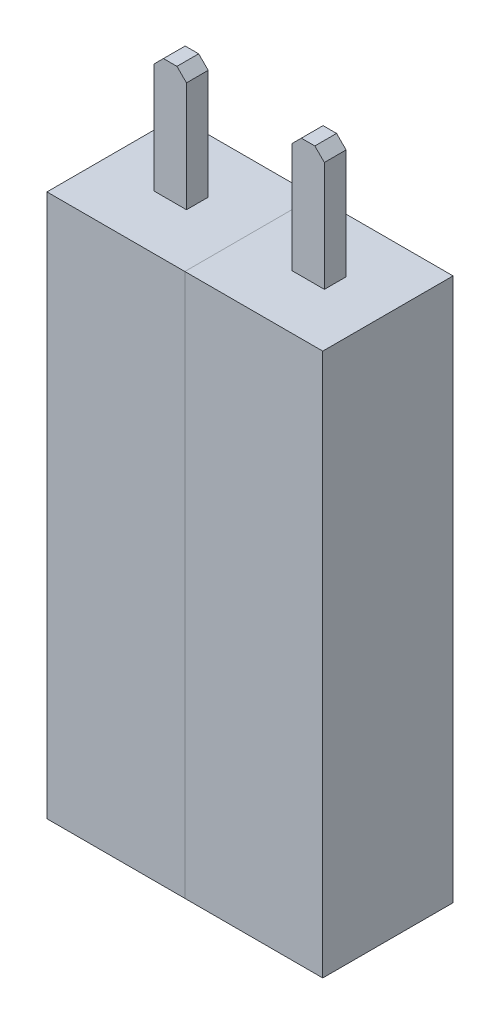
ISO-10303-21;
HEADER;
FILE_DESCRIPTION(('STEP AP214'),'2;1');
FILE_NAME('part.step','',(''),(''),'','','');
FILE_SCHEMA(('AUTOMOTIVE_DESIGN { 1 0 10303 214 1 1 1 1 }'));
ENDSEC;
DATA;
#1=APPLICATION_CONTEXT('core data for automotive mechanical design processes');
#2=APPLICATION_PROTOCOL_DEFINITION('international standard','automotive_design',2000,#1);
#3=PRODUCT_CONTEXT('',#1,'mechanical');
#4=PRODUCT('Part','Part','',(#3));
#5=PRODUCT_RELATED_PRODUCT_CATEGORY('part','',(#4));
#6=PRODUCT_DEFINITION_FORMATION('','',#4);
#7=PRODUCT_DEFINITION_CONTEXT('part definition',#1,'design');
#8=PRODUCT_DEFINITION('design','',#6,#7);
#9=PRODUCT_DEFINITION_SHAPE('','',#8);
#10=(LENGTH_UNIT() NAMED_UNIT(*) SI_UNIT(.MILLI.,.METRE.));
#11=(NAMED_UNIT(*) PLANE_ANGLE_UNIT() SI_UNIT($,.RADIAN.));
#12=(NAMED_UNIT(*) SI_UNIT($,.STERADIAN.) SOLID_ANGLE_UNIT());
#13=UNCERTAINTY_MEASURE_WITH_UNIT(LENGTH_MEASURE(1.E-05),#10,'distance_accuracy_value','');
#14=(GEOMETRIC_REPRESENTATION_CONTEXT(3) GLOBAL_UNCERTAINTY_ASSIGNED_CONTEXT((#13)) GLOBAL_UNIT_ASSIGNED_CONTEXT((#10,
#11,#12)) REPRESENTATION_CONTEXT('',''));
#15=CARTESIAN_POINT('',(0.,0.,0.));
#16=DIRECTION('',(0.,0.,1.));
#17=DIRECTION('',(1.,0.,0.));
#18=AXIS2_PLACEMENT_3D('',#15,#16,#17);
#19=CARTESIAN_POINT('',(3.81,5.,1.2));
#20=DIRECTION('',(-1.,0.,0.));
#21=DIRECTION('',(0.,-1.,0.));
#22=AXIS2_PLACEMENT_3D('',#19,#20,#21);
#23=PLANE('',#22);
#24=DIRECTION('',(0.,1.,0.));
#25=VECTOR('',#24,1.);
#26=CARTESIAN_POINT('',(3.81,5.,-1.2));
#27=LINE('',#26,#25);
#28=CARTESIAN_POINT('',(3.81,-5.,-1.2));
#29=VERTEX_POINT('',#28);
#30=CARTESIAN_POINT('',(3.81,5.,-1.2));
#31=VERTEX_POINT('',#30);
#32=EDGE_CURVE('E198',#29,#31,#27,.T.);
#33=ORIENTED_EDGE('',*,*,#32,.T.);
#34=DIRECTION('',(0.,0.,-1.));
#35=VECTOR('',#34,1.);
#36=CARTESIAN_POINT('',(3.81,5.,1.2));
#37=LINE('',#36,#35);
#38=CARTESIAN_POINT('',(3.81,5.,1.2));
#39=VERTEX_POINT('',#38);
#40=EDGE_CURVE('E12',#39,#31,#37,.T.);
#41=ORIENTED_EDGE('',*,*,#40,.F.);
#42=DIRECTION('',(0.,1.,0.));
#43=VECTOR('',#42,1.);
#44=CARTESIAN_POINT('',(3.81,5.,1.2));
#45=LINE('',#44,#43);
#46=CARTESIAN_POINT('',(3.81,-5.,1.2));
#47=VERTEX_POINT('',#46);
#48=EDGE_CURVE('E204',#47,#39,#45,.T.);
#49=ORIENTED_EDGE('',*,*,#48,.F.);
#50=DIRECTION('',(0.,0.,-1.));
#51=VECTOR('',#50,1.);
#52=CARTESIAN_POINT('',(3.81,-5.,1.2));
#53=LINE('',#52,#51);
#54=EDGE_CURVE('E214',#47,#29,#53,.T.);
#55=ORIENTED_EDGE('',*,*,#54,.T.);
#56=EDGE_LOOP('',(#33,#41,#49,#55));
#57=FACE_BOUND('',#56,.T.);
#58=ADVANCED_FACE('F44',(#57),#23,.F.);
#59=CARTESIAN_POINT('',(1.27,5.,1.2));
#60=DIRECTION('',(0.,-1.,0.));
#61=DIRECTION('',(0.,0.,-1.));
#62=AXIS2_PLACEMENT_3D('',#59,#60,#61);
#63=PLANE('',#62);
#64=DIRECTION('',(0.,0.,-1.));
#65=VECTOR('',#64,1.);
#66=CARTESIAN_POINT('',(2.24,5.,0.2));
#67=LINE('',#66,#65);
#68=CARTESIAN_POINT('',(2.24,5.,0.2));
#69=VERTEX_POINT('',#68);
#70=CARTESIAN_POINT('',(2.24,5.,-0.2));
#71=VERTEX_POINT('',#70);
#72=EDGE_CURVE('E422',#69,#71,#67,.T.);
#73=ORIENTED_EDGE('',*,*,#72,.T.);
#74=DIRECTION('',(1.,0.,0.));
#75=VECTOR('',#74,1.);
#76=CARTESIAN_POINT('',(2.24,5.,-0.2));
#77=LINE('',#76,#75);
#78=CARTESIAN_POINT('',(2.84,5.,-0.2));
#79=VERTEX_POINT('',#78);
#80=EDGE_CURVE('E58',#71,#79,#77,.T.);
#81=ORIENTED_EDGE('',*,*,#80,.T.);
#82=DIRECTION('',(0.,0.,-1.));
#83=VECTOR('',#82,1.);
#84=CARTESIAN_POINT('',(2.84,5.,0.2));
#85=LINE('',#84,#83);
#86=CARTESIAN_POINT('',(2.84,5.,0.2));
#87=VERTEX_POINT('',#86);
#88=EDGE_CURVE('E149',#87,#79,#85,.T.);
#89=ORIENTED_EDGE('',*,*,#88,.F.);
#90=DIRECTION('',(1.,0.,0.));
#91=VECTOR('',#90,1.);
#92=CARTESIAN_POINT('',(2.24,5.,0.2));
#93=LINE('',#92,#91);
#94=EDGE_CURVE('E155',#69,#87,#93,.T.);
#95=ORIENTED_EDGE('',*,*,#94,.F.);
#96=EDGE_LOOP('',(#73,#81,#89,#95));
#97=FACE_BOUND('',#96,.T.);
#98=DIRECTION('',(-1.,0.,0.));
#99=VECTOR('',#98,1.);
#100=CARTESIAN_POINT('',(1.27,5.,-1.2));
#101=LINE('',#100,#99);
#102=CARTESIAN_POINT('',(1.27,5.,-1.2));
#103=VERTEX_POINT('',#102);
#104=EDGE_CURVE('E217',#31,#103,#101,.T.);
#105=ORIENTED_EDGE('',*,*,#104,.T.);
#106=DIRECTION('',(0.,0.,-1.));
#107=VECTOR('',#106,1.);
#108=CARTESIAN_POINT('',(1.27,5.,1.2));
#109=LINE('',#108,#107);
#110=CARTESIAN_POINT('',(1.27,5.,1.2));
#111=VERTEX_POINT('',#110);
#112=EDGE_CURVE('E51',#111,#103,#109,.T.);
#113=ORIENTED_EDGE('',*,*,#112,.F.);
#114=DIRECTION('',(-1.,0.,0.));
#115=VECTOR('',#114,1.);
#116=CARTESIAN_POINT('',(1.27,5.,1.2));
#117=LINE('',#116,#115);
#118=EDGE_CURVE('E207',#39,#111,#117,.T.);
#119=ORIENTED_EDGE('',*,*,#118,.F.);
#120=ORIENTED_EDGE('',*,*,#40,.T.);
#121=EDGE_LOOP('',(#105,#113,#119,#120));
#122=FACE_BOUND('',#121,.T.);
#123=ADVANCED_FACE('F166',(#97,#122),#63,.F.);
#124=CARTESIAN_POINT('',(1.27,5.,1.2));
#125=DIRECTION('',(1.,0.,0.));
#126=DIRECTION('',(0.,1.,0.));
#127=AXIS2_PLACEMENT_3D('',#124,#125,#126);
#128=PLANE('',#127);
#129=DIRECTION('',(0.,-1.,0.));
#130=VECTOR('',#129,1.);
#131=CARTESIAN_POINT('',(1.27,5.,-1.2));
#132=LINE('',#131,#130);
#133=CARTESIAN_POINT('',(1.27,-5.,-1.2));
#134=VERTEX_POINT('',#133);
#135=EDGE_CURVE('E219',#103,#134,#132,.T.);
#136=ORIENTED_EDGE('',*,*,#135,.T.);
#137=DIRECTION('',(0.,0.,-1.));
#138=VECTOR('',#137,1.);
#139=CARTESIAN_POINT('',(1.27,-5.,1.2));
#140=LINE('',#139,#138);
#141=CARTESIAN_POINT('',(1.27,-5.,1.2));
#142=VERTEX_POINT('',#141);
#143=EDGE_CURVE('E224',#142,#134,#140,.T.);
#144=ORIENTED_EDGE('',*,*,#143,.F.);
#145=DIRECTION('',(0.,-1.,0.));
#146=VECTOR('',#145,1.);
#147=CARTESIAN_POINT('',(1.27,5.,1.2));
#148=LINE('',#147,#146);
#149=EDGE_CURVE('E210',#111,#142,#148,.T.);
#150=ORIENTED_EDGE('',*,*,#149,.F.);
#151=ORIENTED_EDGE('',*,*,#112,.T.);
#152=EDGE_LOOP('',(#136,#144,#150,#151));
#153=FACE_BOUND('',#152,.T.);
#154=ADVANCED_FACE('F231',(#153),#128,.F.);
#155=CARTESIAN_POINT('',(1.27,-5.,1.2));
#156=DIRECTION('',(0.,1.,0.));
#157=DIRECTION('',(0.,0.,1.));
#158=AXIS2_PLACEMENT_3D('',#155,#156,#157);
#159=PLANE('',#158);
#160=DIRECTION('',(-1.,0.,0.));
#161=VECTOR('',#160,1.);
#162=CARTESIAN_POINT('',(1.94,-5.,0.6));
#163=LINE('',#162,#161);
#164=CARTESIAN_POINT('',(3.14,-5.,0.6));
#165=VERTEX_POINT('',#164);
#166=CARTESIAN_POINT('',(1.94,-5.,0.6));
#167=VERTEX_POINT('',#166);
#168=EDGE_CURVE('E169',#165,#167,#163,.T.);
#169=ORIENTED_EDGE('',*,*,#168,.F.);
#170=DIRECTION('',(0.,0.,1.));
#171=VECTOR('',#170,1.);
#172=CARTESIAN_POINT('',(3.14,-5.,0.6));
#173=LINE('',#172,#171);
#174=CARTESIAN_POINT('',(3.14,-5.,-0.6));
#175=VERTEX_POINT('',#174);
#176=EDGE_CURVE('E66',#175,#165,#173,.T.);
#177=ORIENTED_EDGE('',*,*,#176,.F.);
#178=DIRECTION('',(1.,0.,0.));
#179=VECTOR('',#178,1.);
#180=CARTESIAN_POINT('',(1.94,-5.,-0.6));
#181=LINE('',#180,#179);
#182=CARTESIAN_POINT('',(1.94,-5.,-0.6));
#183=VERTEX_POINT('',#182);
#184=EDGE_CURVE('E179',#183,#175,#181,.T.);
#185=ORIENTED_EDGE('',*,*,#184,.F.);
#186=DIRECTION('',(0.,0.,-1.));
#187=VECTOR('',#186,1.);
#188=CARTESIAN_POINT('',(1.94,-5.,0.6));
#189=LINE('',#188,#187);
#190=EDGE_CURVE('E191',#167,#183,#189,.T.);
#191=ORIENTED_EDGE('',*,*,#190,.F.);
#192=EDGE_LOOP('',(#169,#177,#185,#191));
#193=FACE_BOUND('',#192,.T.);
#194=DIRECTION('',(1.,0.,0.));
#195=VECTOR('',#194,1.);
#196=CARTESIAN_POINT('',(1.27,-5.,-1.2));
#197=LINE('',#196,#195);
#198=EDGE_CURVE('E208',#134,#29,#197,.T.);
#199=ORIENTED_EDGE('',*,*,#198,.T.);
#200=ORIENTED_EDGE('',*,*,#54,.F.);
#201=DIRECTION('',(1.,0.,0.));
#202=VECTOR('',#201,1.);
#203=CARTESIAN_POINT('',(1.27,-5.,1.2));
#204=LINE('',#203,#202);
#205=EDGE_CURVE('E212',#142,#47,#204,.T.);
#206=ORIENTED_EDGE('',*,*,#205,.F.);
#207=ORIENTED_EDGE('',*,*,#143,.T.);
#208=EDGE_LOOP('',(#199,#200,#206,#207));
#209=FACE_BOUND('',#208,.T.);
#210=ADVANCED_FACE('F239',(#193,#209),#159,.F.);
#211=CARTESIAN_POINT('',(2.54,0.,1.2));
#212=DIRECTION('',(0.,0.,1.));
#213=DIRECTION('',(1.,0.,0.));
#214=AXIS2_PLACEMENT_3D('',#211,#212,#213);
#215=PLANE('',#214);
#216=ORIENTED_EDGE('',*,*,#48,.T.);
#217=ORIENTED_EDGE('',*,*,#118,.T.);
#218=ORIENTED_EDGE('',*,*,#149,.T.);
#219=ORIENTED_EDGE('',*,*,#205,.T.);
#220=EDGE_LOOP('',(#216,#217,#218,#219));
#221=FACE_BOUND('',#220,.T.);
#222=ADVANCED_FACE('F245',(#221),#215,.T.);
#223=CARTESIAN_POINT('',(2.54,0.,-1.2));
#224=DIRECTION('',(0.,0.,1.));
#225=DIRECTION('',(1.,0.,0.));
#226=AXIS2_PLACEMENT_3D('',#223,#224,#225);
#227=PLANE('',#226);
#228=ORIENTED_EDGE('',*,*,#32,.F.);
#229=ORIENTED_EDGE('',*,*,#198,.F.);
#230=ORIENTED_EDGE('',*,*,#135,.F.);
#231=ORIENTED_EDGE('',*,*,#104,.F.);
#232=EDGE_LOOP('',(#228,#229,#230,#231));
#233=FACE_BOUND('',#232,.T.);
#234=ADVANCED_FACE('F236',(#233),#227,.F.);
#235=CARTESIAN_POINT('',(3.14,2.,0.6));
#236=DIRECTION('',(1.,0.,0.));
#237=DIRECTION('',(0.,0.,-1.));
#238=AXIS2_PLACEMENT_3D('',#235,#236,#237);
#239=PLANE('',#238);
#240=ORIENTED_EDGE('',*,*,#176,.T.);
#241=DIRECTION('',(0.,-1.,0.));
#242=VECTOR('',#241,1.);
#243=CARTESIAN_POINT('',(3.14,2.,0.6));
#244=LINE('',#243,#242);
#245=CARTESIAN_POINT('',(3.14,2.,0.6));
#246=VERTEX_POINT('',#245);
#247=EDGE_CURVE('E187',#246,#165,#244,.T.);
#248=ORIENTED_EDGE('',*,*,#247,.F.);
#249=DIRECTION('',(0.,0.,1.));
#250=VECTOR('',#249,1.);
#251=CARTESIAN_POINT('',(3.14,2.,0.6));
#252=LINE('',#251,#250);
#253=CARTESIAN_POINT('',(3.14,2.,-0.6));
#254=VERTEX_POINT('',#253);
#255=EDGE_CURVE('E175',#254,#246,#252,.T.);
#256=ORIENTED_EDGE('',*,*,#255,.F.);
#257=DIRECTION('',(0.,-1.,0.));
#258=VECTOR('',#257,1.);
#259=CARTESIAN_POINT('',(3.14,2.,-0.6));
#260=LINE('',#259,#258);
#261=EDGE_CURVE('E196',#254,#175,#260,.T.);
#262=ORIENTED_EDGE('',*,*,#261,.T.);
#263=EDGE_LOOP('',(#240,#248,#256,#262));
#264=FACE_BOUND('',#263,.T.);
#265=ADVANCED_FACE('F258',(#264),#239,.F.);
#266=CARTESIAN_POINT('',(1.94,2.,-0.6));
#267=DIRECTION('',(0.,0.,-1.));
#268=DIRECTION('',(-1.,0.,0.));
#269=AXIS2_PLACEMENT_3D('',#266,#267,#268);
#270=PLANE('',#269);
#271=ORIENTED_EDGE('',*,*,#184,.T.);
#272=ORIENTED_EDGE('',*,*,#261,.F.);
#273=DIRECTION('',(1.,0.,0.));
#274=VECTOR('',#273,1.);
#275=CARTESIAN_POINT('',(1.94,2.,-0.6));
#276=LINE('',#275,#274);
#277=CARTESIAN_POINT('',(1.94,2.,-0.6));
#278=VERTEX_POINT('',#277);
#279=EDGE_CURVE('E185',#278,#254,#276,.T.);
#280=ORIENTED_EDGE('',*,*,#279,.F.);
#281=DIRECTION('',(0.,-1.,0.));
#282=VECTOR('',#281,1.);
#283=CARTESIAN_POINT('',(1.94,2.,-0.6));
#284=LINE('',#283,#282);
#285=EDGE_CURVE('E199',#278,#183,#284,.T.);
#286=ORIENTED_EDGE('',*,*,#285,.T.);
#287=EDGE_LOOP('',(#271,#272,#280,#286));
#288=FACE_BOUND('',#287,.T.);
#289=ADVANCED_FACE('F263',(#288),#270,.F.);
#290=CARTESIAN_POINT('',(1.94,2.,0.6));
#291=DIRECTION('',(-1.,0.,0.));
#292=DIRECTION('',(0.,0.,1.));
#293=AXIS2_PLACEMENT_3D('',#290,#291,#292);
#294=PLANE('',#293);
#295=ORIENTED_EDGE('',*,*,#190,.T.);
#296=ORIENTED_EDGE('',*,*,#285,.F.);
#297=DIRECTION('',(0.,0.,-1.));
#298=VECTOR('',#297,1.);
#299=CARTESIAN_POINT('',(1.94,2.,0.6));
#300=LINE('',#299,#298);
#301=CARTESIAN_POINT('',(1.94,2.,0.6));
#302=VERTEX_POINT('',#301);
#303=EDGE_CURVE('E182',#302,#278,#300,.T.);
#304=ORIENTED_EDGE('',*,*,#303,.F.);
#305=DIRECTION('',(0.,-1.,0.));
#306=VECTOR('',#305,1.);
#307=CARTESIAN_POINT('',(1.94,2.,0.6));
#308=LINE('',#307,#306);
#309=EDGE_CURVE('E201',#302,#167,#308,.T.);
#310=ORIENTED_EDGE('',*,*,#309,.T.);
#311=EDGE_LOOP('',(#295,#296,#304,#310));
#312=FACE_BOUND('',#311,.T.);
#313=ADVANCED_FACE('F268',(#312),#294,.F.);
#314=CARTESIAN_POINT('',(1.94,2.,0.6));
#315=DIRECTION('',(0.,0.,1.));
#316=DIRECTION('',(1.,0.,0.));
#317=AXIS2_PLACEMENT_3D('',#314,#315,#316);
#318=PLANE('',#317);
#319=ORIENTED_EDGE('',*,*,#168,.T.);
#320=ORIENTED_EDGE('',*,*,#309,.F.);
#321=DIRECTION('',(-1.,0.,0.));
#322=VECTOR('',#321,1.);
#323=CARTESIAN_POINT('',(1.94,2.,0.6));
#324=LINE('',#323,#322);
#325=EDGE_CURVE('E178',#246,#302,#324,.T.);
#326=ORIENTED_EDGE('',*,*,#325,.F.);
#327=ORIENTED_EDGE('',*,*,#247,.T.);
#328=EDGE_LOOP('',(#319,#320,#326,#327));
#329=FACE_BOUND('',#328,.T.);
#330=ADVANCED_FACE('F264',(#329),#318,.F.);
#331=CARTESIAN_POINT('',(2.54,2.,0.));
#332=DIRECTION('',(0.,-1.,0.));
#333=DIRECTION('',(0.,0.,-1.));
#334=AXIS2_PLACEMENT_3D('',#331,#332,#333);
#335=PLANE('',#334);
#336=ORIENTED_EDGE('',*,*,#255,.T.);
#337=ORIENTED_EDGE('',*,*,#325,.T.);
#338=ORIENTED_EDGE('',*,*,#303,.T.);
#339=ORIENTED_EDGE('',*,*,#279,.T.);
#340=EDGE_LOOP('',(#336,#337,#338,#339));
#341=FACE_BOUND('',#340,.T.);
#342=ADVANCED_FACE('F267',(#341),#335,.T.);
#343=CARTESIAN_POINT('',(2.84,5.,0.2));
#344=DIRECTION('',(-1.,0.,0.));
#345=DIRECTION('',(0.,-1.,0.));
#346=AXIS2_PLACEMENT_3D('',#343,#344,#345);
#347=PLANE('',#346);
#348=DIRECTION('',(0.,1.,0.));
#349=VECTOR('',#348,1.);
#350=CARTESIAN_POINT('',(2.84,5.,-0.2));
#351=LINE('',#350,#349);
#352=CARTESIAN_POINT('',(2.84,7.02426406871196,-0.2));
#353=VERTEX_POINT('',#352);
#354=EDGE_CURVE('E446',#79,#353,#351,.T.);
#355=ORIENTED_EDGE('',*,*,#354,.T.);
#356=DIRECTION('',(0.,0.,-1.));
#357=VECTOR('',#356,1.);
#358=CARTESIAN_POINT('',(2.84,7.02426406871196,0.2));
#359=LINE('',#358,#357);
#360=CARTESIAN_POINT('',(2.84,7.02426406871196,0.2));
#361=VERTEX_POINT('',#360);
#362=EDGE_CURVE('E151',#361,#353,#359,.T.);
#363=ORIENTED_EDGE('',*,*,#362,.F.);
#364=DIRECTION('',(0.,1.,0.));
#365=VECTOR('',#364,1.);
#366=CARTESIAN_POINT('',(2.84,5.,0.2));
#367=LINE('',#366,#365);
#368=EDGE_CURVE('E145',#87,#361,#367,.T.);
#369=ORIENTED_EDGE('',*,*,#368,.F.);
#370=ORIENTED_EDGE('',*,*,#88,.T.);
#371=EDGE_LOOP('',(#355,#363,#369,#370));
#372=FACE_BOUND('',#371,.T.);
#373=ADVANCED_FACE('F147',(#372),#347,.F.);
#374=CARTESIAN_POINT('',(2.84,7.02426406871196,0.2));
#375=DIRECTION('',(-0.707106781186544,-0.707106781186551,0.));
#376=DIRECTION('',(0.707106781186551,-0.707106781186544,0.));
#377=AXIS2_PLACEMENT_3D('',#374,#375,#376);
#378=PLANE('',#377);
#379=DIRECTION('',(-0.707106781186551,0.707106781186544,0.));
#380=VECTOR('',#379,1.);
#381=CARTESIAN_POINT('',(2.84,7.02426406871196,-0.2));
#382=LINE('',#381,#380);
#383=CARTESIAN_POINT('',(2.66426406871193,7.20000000000003,-0.2));
#384=VERTEX_POINT('',#383);
#385=EDGE_CURVE('E444',#353,#384,#382,.T.);
#386=ORIENTED_EDGE('',*,*,#385,.T.);
#387=DIRECTION('',(0.,0.,-1.));
#388=VECTOR('',#387,1.);
#389=CARTESIAN_POINT('',(2.66426406871193,7.20000000000003,0.2));
#390=LINE('',#389,#388);
#391=CARTESIAN_POINT('',(2.66426406871193,7.20000000000003,0.2));
#392=VERTEX_POINT('',#391);
#393=EDGE_CURVE('E171',#392,#384,#390,.T.);
#394=ORIENTED_EDGE('',*,*,#393,.F.);
#395=DIRECTION('',(-0.707106781186551,0.707106781186544,0.));
#396=VECTOR('',#395,1.);
#397=CARTESIAN_POINT('',(2.84,7.02426406871196,0.2));
#398=LINE('',#397,#396);
#399=EDGE_CURVE('E154',#361,#392,#398,.T.);
#400=ORIENTED_EDGE('',*,*,#399,.F.);
#401=ORIENTED_EDGE('',*,*,#362,.T.);
#402=EDGE_LOOP('',(#386,#394,#400,#401));
#403=FACE_BOUND('',#402,.T.);
#404=ADVANCED_FACE('F281',(#403),#378,.F.);
#405=CARTESIAN_POINT('',(2.41573593128807,7.20000000000003,0.2));
#406=DIRECTION('',(0.,-1.,0.));
#407=DIRECTION('',(1.,0.,0.));
#408=AXIS2_PLACEMENT_3D('',#405,#406,#407);
#409=PLANE('',#408);
#410=DIRECTION('',(-1.,0.,0.));
#411=VECTOR('',#410,1.);
#412=CARTESIAN_POINT('',(2.41573593128807,7.20000000000003,-0.2));
#413=LINE('',#412,#411);
#414=CARTESIAN_POINT('',(2.41573593128807,7.20000000000003,-0.2));
#415=VERTEX_POINT('',#414);
#416=EDGE_CURVE('E441',#384,#415,#413,.T.);
#417=ORIENTED_EDGE('',*,*,#416,.T.);
#418=DIRECTION('',(0.,0.,-1.));
#419=VECTOR('',#418,1.);
#420=CARTESIAN_POINT('',(2.41573593128807,7.20000000000003,0.2));
#421=LINE('',#420,#419);
#422=CARTESIAN_POINT('',(2.41573593128807,7.20000000000003,0.2));
#423=VERTEX_POINT('',#422);
#424=EDGE_CURVE('E429',#423,#415,#421,.T.);
#425=ORIENTED_EDGE('',*,*,#424,.F.);
#426=DIRECTION('',(-1.,0.,0.));
#427=VECTOR('',#426,1.);
#428=CARTESIAN_POINT('',(2.41573593128807,7.20000000000003,0.2));
#429=LINE('',#428,#427);
#430=EDGE_CURVE('E442',#392,#423,#429,.T.);
#431=ORIENTED_EDGE('',*,*,#430,.F.);
#432=ORIENTED_EDGE('',*,*,#393,.T.);
#433=EDGE_LOOP('',(#417,#425,#431,#432));
#434=FACE_BOUND('',#433,.T.);
#435=ADVANCED_FACE('F284',(#434),#409,.F.);
#436=CARTESIAN_POINT('',(2.24,7.02426406871196,0.2));
#437=DIRECTION('',(0.707106781186552,-0.707106781186543,0.));
#438=DIRECTION('',(0.707106781186543,0.707106781186552,0.));
#439=AXIS2_PLACEMENT_3D('',#436,#437,#438);
#440=PLANE('',#439);
#441=DIRECTION('',(-0.707106781186543,-0.707106781186552,0.));
#442=VECTOR('',#441,1.);
#443=CARTESIAN_POINT('',(2.24,7.02426406871196,-0.2));
#444=LINE('',#443,#442);
#445=CARTESIAN_POINT('',(2.24,7.02426406871196,-0.2));
#446=VERTEX_POINT('',#445);
#447=EDGE_CURVE('E426',#415,#446,#444,.T.);
#448=ORIENTED_EDGE('',*,*,#447,.T.);
#449=DIRECTION('',(0.,0.,-1.));
#450=VECTOR('',#449,1.);
#451=CARTESIAN_POINT('',(2.24,7.02426406871196,0.2));
#452=LINE('',#451,#450);
#453=CARTESIAN_POINT('',(2.24,7.02426406871196,0.2));
#454=VERTEX_POINT('',#453);
#455=EDGE_CURVE('E424',#454,#446,#452,.T.);
#456=ORIENTED_EDGE('',*,*,#455,.F.);
#457=DIRECTION('',(-0.707106781186543,-0.707106781186552,0.));
#458=VECTOR('',#457,1.);
#459=CARTESIAN_POINT('',(2.24,7.02426406871196,0.2));
#460=LINE('',#459,#458);
#461=EDGE_CURVE('E431',#423,#454,#460,.T.);
#462=ORIENTED_EDGE('',*,*,#461,.F.);
#463=ORIENTED_EDGE('',*,*,#424,.T.);
#464=EDGE_LOOP('',(#448,#456,#462,#463));
#465=FACE_BOUND('',#464,.T.);
#466=ADVANCED_FACE('F288',(#465),#440,.F.);
#467=CARTESIAN_POINT('',(2.24,5.,0.2));
#468=DIRECTION('',(1.,0.,0.));
#469=DIRECTION('',(0.,1.,0.));
#470=AXIS2_PLACEMENT_3D('',#467,#468,#469);
#471=PLANE('',#470);
#472=DIRECTION('',(0.,-1.,0.));
#473=VECTOR('',#472,1.);
#474=CARTESIAN_POINT('',(2.24,5.,-0.2));
#475=LINE('',#474,#473);
#476=EDGE_CURVE('E164',#446,#71,#475,.T.);
#477=ORIENTED_EDGE('',*,*,#476,.T.);
#478=ORIENTED_EDGE('',*,*,#72,.F.);
#479=DIRECTION('',(0.,-1.,0.));
#480=VECTOR('',#479,1.);
#481=CARTESIAN_POINT('',(2.24,5.,0.2));
#482=LINE('',#481,#480);
#483=EDGE_CURVE('E160',#454,#69,#482,.T.);
#484=ORIENTED_EDGE('',*,*,#483,.F.);
#485=ORIENTED_EDGE('',*,*,#455,.T.);
#486=EDGE_LOOP('',(#477,#478,#484,#485));
#487=FACE_BOUND('',#486,.T.);
#488=ADVANCED_FACE('F292',(#487),#471,.F.);
#489=CARTESIAN_POINT('',(2.54,0.,0.2));
#490=DIRECTION('',(0.,0.,1.));
#491=DIRECTION('',(1.,0.,0.));
#492=AXIS2_PLACEMENT_3D('',#489,#490,#491);
#493=PLANE('',#492);
#494=ORIENTED_EDGE('',*,*,#94,.T.);
#495=ORIENTED_EDGE('',*,*,#368,.T.);
#496=ORIENTED_EDGE('',*,*,#399,.T.);
#497=ORIENTED_EDGE('',*,*,#430,.T.);
#498=ORIENTED_EDGE('',*,*,#461,.T.);
#499=ORIENTED_EDGE('',*,*,#483,.T.);
#500=EDGE_LOOP('',(#494,#495,#496,#497,#498,#499));
#501=FACE_BOUND('',#500,.T.);
#502=ADVANCED_FACE('F158',(#501),#493,.T.);
#503=CARTESIAN_POINT('',(2.54,0.,-0.2));
#504=DIRECTION('',(0.,0.,1.));
#505=DIRECTION('',(1.,0.,0.));
#506=AXIS2_PLACEMENT_3D('',#503,#504,#505);
#507=PLANE('',#506);
#508=ORIENTED_EDGE('',*,*,#80,.F.);
#509=ORIENTED_EDGE('',*,*,#476,.F.);
#510=ORIENTED_EDGE('',*,*,#447,.F.);
#511=ORIENTED_EDGE('',*,*,#416,.F.);
#512=ORIENTED_EDGE('',*,*,#385,.F.);
#513=ORIENTED_EDGE('',*,*,#354,.F.);
#514=EDGE_LOOP('',(#508,#509,#510,#511,#512,#513));
#515=FACE_BOUND('',#514,.T.);
#516=ADVANCED_FACE('F297',(#515),#507,.F.);
#517=CLOSED_SHELL('',(#58,#123,#154,#210,#222,#234,#265,#289,#313,#330,#342,#373,#404,#435,#466,
#488,#502,#516));
#518=MANIFOLD_SOLID_BREP('B2',#517);
#519=CARTESIAN_POINT('',(1.27,5.,1.2));
#520=DIRECTION('',(-1.,0.,0.));
#521=DIRECTION('',(0.,-1.,0.));
#522=AXIS2_PLACEMENT_3D('',#519,#520,#521);
#523=PLANE('',#522);
#524=DIRECTION('',(0.,1.,0.));
#525=VECTOR('',#524,1.);
#526=CARTESIAN_POINT('',(1.27,5.,-1.2));
#527=LINE('',#526,#525);
#528=CARTESIAN_POINT('',(1.27,-5.,-1.2));
#529=VERTEX_POINT('',#528);
#530=CARTESIAN_POINT('',(1.27,5.,-1.2));
#531=VERTEX_POINT('',#530);
#532=EDGE_CURVE('E617',#529,#531,#527,.T.);
#533=ORIENTED_EDGE('',*,*,#532,.T.);
#534=DIRECTION('',(0.,0.,-1.));
#535=VECTOR('',#534,1.);
#536=CARTESIAN_POINT('',(1.27,5.,1.2));
#537=LINE('',#536,#535);
#538=CARTESIAN_POINT('',(1.27,5.,1.2));
#539=VERTEX_POINT('',#538);
#540=EDGE_CURVE('E42',#539,#531,#537,.T.);
#541=ORIENTED_EDGE('',*,*,#540,.F.);
#542=DIRECTION('',(0.,1.,0.));
#543=VECTOR('',#542,1.);
#544=CARTESIAN_POINT('',(1.27,5.,1.2));
#545=LINE('',#544,#543);
#546=CARTESIAN_POINT('',(1.27,-5.,1.2));
#547=VERTEX_POINT('',#546);
#548=EDGE_CURVE('E623',#547,#539,#545,.T.);
#549=ORIENTED_EDGE('',*,*,#548,.F.);
#550=DIRECTION('',(0.,0.,-1.));
#551=VECTOR('',#550,1.);
#552=CARTESIAN_POINT('',(1.27,-5.,1.2));
#553=LINE('',#552,#551);
#554=EDGE_CURVE('E633',#547,#529,#553,.T.);
#555=ORIENTED_EDGE('',*,*,#554,.T.);
#556=EDGE_LOOP('',(#533,#541,#549,#555));
#557=FACE_BOUND('',#556,.T.);
#558=ADVANCED_FACE('F463',(#557),#523,.F.);
#559=CARTESIAN_POINT('',(-1.27,5.,1.2));
#560=DIRECTION('',(0.,-1.,0.));
#561=DIRECTION('',(0.,0.,-1.));
#562=AXIS2_PLACEMENT_3D('',#559,#560,#561);
#563=PLANE('',#562);
#564=DIRECTION('',(0.,0.,-1.));
#565=VECTOR('',#564,1.);
#566=CARTESIAN_POINT('',(-0.299999999999999,5.,0.2));
#567=LINE('',#566,#565);
#568=CARTESIAN_POINT('',(-0.299999999999999,5.,0.2));
#569=VERTEX_POINT('',#568);
#570=CARTESIAN_POINT('',(-0.299999999999999,5.,-0.2));
#571=VERTEX_POINT('',#570);
#572=EDGE_CURVE('E827',#569,#571,#567,.T.);
#573=ORIENTED_EDGE('',*,*,#572,.T.);
#574=DIRECTION('',(1.,0.,0.));
#575=VECTOR('',#574,1.);
#576=CARTESIAN_POINT('',(-0.299999999999999,5.,-0.2));
#577=LINE('',#576,#575);
#578=CARTESIAN_POINT('',(0.3,5.,-0.2));
#579=VERTEX_POINT('',#578);
#580=EDGE_CURVE('E477',#571,#579,#577,.T.);
#581=ORIENTED_EDGE('',*,*,#580,.T.);
#582=DIRECTION('',(0.,0.,-1.));
#583=VECTOR('',#582,1.);
#584=CARTESIAN_POINT('',(0.3,5.,0.2));
#585=LINE('',#584,#583);
#586=CARTESIAN_POINT('',(0.3,5.,0.2));
#587=VERTEX_POINT('',#586);
#588=EDGE_CURVE('E568',#587,#579,#585,.T.);
#589=ORIENTED_EDGE('',*,*,#588,.F.);
#590=DIRECTION('',(1.,0.,0.));
#591=VECTOR('',#590,1.);
#592=CARTESIAN_POINT('',(-0.299999999999999,5.,0.2));
#593=LINE('',#592,#591);
#594=EDGE_CURVE('E574',#569,#587,#593,.T.);
#595=ORIENTED_EDGE('',*,*,#594,.F.);
#596=EDGE_LOOP('',(#573,#581,#589,#595));
#597=FACE_BOUND('',#596,.T.);
#598=DIRECTION('',(-1.,0.,0.));
#599=VECTOR('',#598,1.);
#600=CARTESIAN_POINT('',(-1.27,5.,-1.2));
#601=LINE('',#600,#599);
#602=CARTESIAN_POINT('',(-1.27,5.,-1.2));
#603=VERTEX_POINT('',#602);
#604=EDGE_CURVE('E636',#531,#603,#601,.T.);
#605=ORIENTED_EDGE('',*,*,#604,.T.);
#606=DIRECTION('',(0.,0.,-1.));
#607=VECTOR('',#606,1.);
#608=CARTESIAN_POINT('',(-1.27,5.,1.2));
#609=LINE('',#608,#607);
#610=CARTESIAN_POINT('',(-1.27,5.,1.2));
#611=VERTEX_POINT('',#610);
#612=EDGE_CURVE('E470',#611,#603,#609,.T.);
#613=ORIENTED_EDGE('',*,*,#612,.F.);
#614=DIRECTION('',(-1.,0.,0.));
#615=VECTOR('',#614,1.);
#616=CARTESIAN_POINT('',(-1.27,5.,1.2));
#617=LINE('',#616,#615);
#618=EDGE_CURVE('E626',#539,#611,#617,.T.);
#619=ORIENTED_EDGE('',*,*,#618,.F.);
#620=ORIENTED_EDGE('',*,*,#540,.T.);
#621=EDGE_LOOP('',(#605,#613,#619,#620));
#622=FACE_BOUND('',#621,.T.);
#623=ADVANCED_FACE('F585',(#597,#622),#563,.F.);
#624=CARTESIAN_POINT('',(-1.27,5.,1.2));
#625=DIRECTION('',(1.,0.,0.));
#626=DIRECTION('',(0.,1.,0.));
#627=AXIS2_PLACEMENT_3D('',#624,#625,#626);
#628=PLANE('',#627);
#629=DIRECTION('',(0.,-1.,0.));
#630=VECTOR('',#629,1.);
#631=CARTESIAN_POINT('',(-1.27,5.,-1.2));
#632=LINE('',#631,#630);
#633=CARTESIAN_POINT('',(-1.27,-5.,-1.2));
#634=VERTEX_POINT('',#633);
#635=EDGE_CURVE('E638',#603,#634,#632,.T.);
#636=ORIENTED_EDGE('',*,*,#635,.T.);
#637=DIRECTION('',(0.,0.,-1.));
#638=VECTOR('',#637,1.);
#639=CARTESIAN_POINT('',(-1.27,-5.,1.2));
#640=LINE('',#639,#638);
#641=CARTESIAN_POINT('',(-1.27,-5.,1.2));
#642=VERTEX_POINT('',#641);
#643=EDGE_CURVE('E643',#642,#634,#640,.T.);
#644=ORIENTED_EDGE('',*,*,#643,.F.);
#645=DIRECTION('',(0.,-1.,0.));
#646=VECTOR('',#645,1.);
#647=CARTESIAN_POINT('',(-1.27,5.,1.2));
#648=LINE('',#647,#646);
#649=EDGE_CURVE('E629',#611,#642,#648,.T.);
#650=ORIENTED_EDGE('',*,*,#649,.F.);
#651=ORIENTED_EDGE('',*,*,#612,.T.);
#652=EDGE_LOOP('',(#636,#644,#650,#651));
#653=FACE_BOUND('',#652,.T.);
#654=ADVANCED_FACE('F650',(#653),#628,.F.);
#655=CARTESIAN_POINT('',(-1.27,-5.,1.2));
#656=DIRECTION('',(0.,1.,0.));
#657=DIRECTION('',(0.,0.,1.));
#658=AXIS2_PLACEMENT_3D('',#655,#656,#657);
#659=PLANE('',#658);
#660=DIRECTION('',(-1.,0.,0.));
#661=VECTOR('',#660,1.);
#662=CARTESIAN_POINT('',(-0.6,-5.,0.6));
#663=LINE('',#662,#661);
#664=CARTESIAN_POINT('',(0.6,-5.,0.6));
#665=VERTEX_POINT('',#664);
#666=CARTESIAN_POINT('',(-0.6,-5.,0.6));
#667=VERTEX_POINT('',#666);
#668=EDGE_CURVE('E588',#665,#667,#663,.T.);
#669=ORIENTED_EDGE('',*,*,#668,.F.);
#670=DIRECTION('',(0.,0.,1.));
#671=VECTOR('',#670,1.);
#672=CARTESIAN_POINT('',(0.6,-5.,0.6));
#673=LINE('',#672,#671);
#674=CARTESIAN_POINT('',(0.6,-5.,-0.6));
#675=VERTEX_POINT('',#674);
#676=EDGE_CURVE('E485',#675,#665,#673,.T.);
#677=ORIENTED_EDGE('',*,*,#676,.F.);
#678=DIRECTION('',(1.,0.,0.));
#679=VECTOR('',#678,1.);
#680=CARTESIAN_POINT('',(-0.6,-5.,-0.6));
#681=LINE('',#680,#679);
#682=CARTESIAN_POINT('',(-0.6,-5.,-0.6));
#683=VERTEX_POINT('',#682);
#684=EDGE_CURVE('E598',#683,#675,#681,.T.);
#685=ORIENTED_EDGE('',*,*,#684,.F.);
#686=DIRECTION('',(0.,0.,-1.));
#687=VECTOR('',#686,1.);
#688=CARTESIAN_POINT('',(-0.6,-5.,0.6));
#689=LINE('',#688,#687);
#690=EDGE_CURVE('E610',#667,#683,#689,.T.);
#691=ORIENTED_EDGE('',*,*,#690,.F.);
#692=EDGE_LOOP('',(#669,#677,#685,#691));
#693=FACE_BOUND('',#692,.T.);
#694=DIRECTION('',(1.,0.,0.));
#695=VECTOR('',#694,1.);
#696=CARTESIAN_POINT('',(-1.27,-5.,-1.2));
#697=LINE('',#696,#695);
#698=EDGE_CURVE('E627',#634,#529,#697,.T.);
#699=ORIENTED_EDGE('',*,*,#698,.T.);
#700=ORIENTED_EDGE('',*,*,#554,.F.);
#701=DIRECTION('',(1.,0.,0.));
#702=VECTOR('',#701,1.);
#703=CARTESIAN_POINT('',(-1.27,-5.,1.2));
#704=LINE('',#703,#702);
#705=EDGE_CURVE('E631',#642,#547,#704,.T.);
#706=ORIENTED_EDGE('',*,*,#705,.F.);
#707=ORIENTED_EDGE('',*,*,#643,.T.);
#708=EDGE_LOOP('',(#699,#700,#706,#707));
#709=FACE_BOUND('',#708,.T.);
#710=ADVANCED_FACE('F658',(#693,#709),#659,.F.);
#711=CARTESIAN_POINT('',(0.,0.,1.2));
#712=DIRECTION('',(0.,0.,1.));
#713=DIRECTION('',(1.,0.,0.));
#714=AXIS2_PLACEMENT_3D('',#711,#712,#713);
#715=PLANE('',#714);
#716=ORIENTED_EDGE('',*,*,#548,.T.);
#717=ORIENTED_EDGE('',*,*,#618,.T.);
#718=ORIENTED_EDGE('',*,*,#649,.T.);
#719=ORIENTED_EDGE('',*,*,#705,.T.);
#720=EDGE_LOOP('',(#716,#717,#718,#719));
#721=FACE_BOUND('',#720,.T.);
#722=ADVANCED_FACE('F664',(#721),#715,.T.);
#723=CARTESIAN_POINT('',(0.,0.,-1.2));
#724=DIRECTION('',(0.,0.,1.));
#725=DIRECTION('',(1.,0.,0.));
#726=AXIS2_PLACEMENT_3D('',#723,#724,#725);
#727=PLANE('',#726);
#728=ORIENTED_EDGE('',*,*,#532,.F.);
#729=ORIENTED_EDGE('',*,*,#698,.F.);
#730=ORIENTED_EDGE('',*,*,#635,.F.);
#731=ORIENTED_EDGE('',*,*,#604,.F.);
#732=EDGE_LOOP('',(#728,#729,#730,#731));
#733=FACE_BOUND('',#732,.T.);
#734=ADVANCED_FACE('F655',(#733),#727,.F.);
#735=CARTESIAN_POINT('',(0.6,2.,0.6));
#736=DIRECTION('',(1.,0.,0.));
#737=DIRECTION('',(0.,0.,-1.));
#738=AXIS2_PLACEMENT_3D('',#735,#736,#737);
#739=PLANE('',#738);
#740=ORIENTED_EDGE('',*,*,#676,.T.);
#741=DIRECTION('',(0.,-1.,0.));
#742=VECTOR('',#741,1.);
#743=CARTESIAN_POINT('',(0.6,2.,0.6));
#744=LINE('',#743,#742);
#745=CARTESIAN_POINT('',(0.6,2.,0.6));
#746=VERTEX_POINT('',#745);
#747=EDGE_CURVE('E606',#746,#665,#744,.T.);
#748=ORIENTED_EDGE('',*,*,#747,.F.);
#749=DIRECTION('',(0.,0.,1.));
#750=VECTOR('',#749,1.);
#751=CARTESIAN_POINT('',(0.6,2.,0.6));
#752=LINE('',#751,#750);
#753=CARTESIAN_POINT('',(0.6,2.,-0.6));
#754=VERTEX_POINT('',#753);
#755=EDGE_CURVE('E594',#754,#746,#752,.T.);
#756=ORIENTED_EDGE('',*,*,#755,.F.);
#757=DIRECTION('',(0.,-1.,0.));
#758=VECTOR('',#757,1.);
#759=CARTESIAN_POINT('',(0.6,2.,-0.6));
#760=LINE('',#759,#758);
#761=EDGE_CURVE('E615',#754,#675,#760,.T.);
#762=ORIENTED_EDGE('',*,*,#761,.T.);
#763=EDGE_LOOP('',(#740,#748,#756,#762));
#764=FACE_BOUND('',#763,.T.);
#765=ADVANCED_FACE('F679',(#764),#739,.F.);
#766=CARTESIAN_POINT('',(-0.6,2.,-0.6));
#767=DIRECTION('',(0.,0.,-1.));
#768=DIRECTION('',(-1.,0.,0.));
#769=AXIS2_PLACEMENT_3D('',#766,#767,#768);
#770=PLANE('',#769);
#771=ORIENTED_EDGE('',*,*,#684,.T.);
#772=ORIENTED_EDGE('',*,*,#761,.F.);
#773=DIRECTION('',(1.,0.,0.));
#774=VECTOR('',#773,1.);
#775=CARTESIAN_POINT('',(-0.6,2.,-0.6));
#776=LINE('',#775,#774);
#777=CARTESIAN_POINT('',(-0.6,2.,-0.6));
#778=VERTEX_POINT('',#777);
#779=EDGE_CURVE('E604',#778,#754,#776,.T.);
#780=ORIENTED_EDGE('',*,*,#779,.F.);
#781=DIRECTION('',(0.,-1.,0.));
#782=VECTOR('',#781,1.);
#783=CARTESIAN_POINT('',(-0.6,2.,-0.6));
#784=LINE('',#783,#782);
#785=EDGE_CURVE('E618',#778,#683,#784,.T.);
#786=ORIENTED_EDGE('',*,*,#785,.T.);
#787=EDGE_LOOP('',(#771,#772,#780,#786));
#788=FACE_BOUND('',#787,.T.);
#789=ADVANCED_FACE('F684',(#788),#770,.F.);
#790=CARTESIAN_POINT('',(-0.6,2.,0.6));
#791=DIRECTION('',(-1.,0.,0.));
#792=DIRECTION('',(0.,0.,1.));
#793=AXIS2_PLACEMENT_3D('',#790,#791,#792);
#794=PLANE('',#793);
#795=ORIENTED_EDGE('',*,*,#690,.T.);
#796=ORIENTED_EDGE('',*,*,#785,.F.);
#797=DIRECTION('',(0.,0.,-1.));
#798=VECTOR('',#797,1.);
#799=CARTESIAN_POINT('',(-0.6,2.,0.6));
#800=LINE('',#799,#798);
#801=CARTESIAN_POINT('',(-0.6,2.,0.6));
#802=VERTEX_POINT('',#801);
#803=EDGE_CURVE('E601',#802,#778,#800,.T.);
#804=ORIENTED_EDGE('',*,*,#803,.F.);
#805=DIRECTION('',(0.,-1.,0.));
#806=VECTOR('',#805,1.);
#807=CARTESIAN_POINT('',(-0.6,2.,0.6));
#808=LINE('',#807,#806);
#809=EDGE_CURVE('E620',#802,#667,#808,.T.);
#810=ORIENTED_EDGE('',*,*,#809,.T.);
#811=EDGE_LOOP('',(#795,#796,#804,#810));
#812=FACE_BOUND('',#811,.T.);
#813=ADVANCED_FACE('F689',(#812),#794,.F.);
#814=CARTESIAN_POINT('',(-0.6,2.,0.6));
#815=DIRECTION('',(0.,0.,1.));
#816=DIRECTION('',(1.,0.,0.));
#817=AXIS2_PLACEMENT_3D('',#814,#815,#816);
#818=PLANE('',#817);
#819=ORIENTED_EDGE('',*,*,#668,.T.);
#820=ORIENTED_EDGE('',*,*,#809,.F.);
#821=DIRECTION('',(-1.,0.,0.));
#822=VECTOR('',#821,1.);
#823=CARTESIAN_POINT('',(-0.6,2.,0.6));
#824=LINE('',#823,#822);
#825=EDGE_CURVE('E597',#746,#802,#824,.T.);
#826=ORIENTED_EDGE('',*,*,#825,.F.);
#827=ORIENTED_EDGE('',*,*,#747,.T.);
#828=EDGE_LOOP('',(#819,#820,#826,#827));
#829=FACE_BOUND('',#828,.T.);
#830=ADVANCED_FACE('F685',(#829),#818,.F.);
#831=CARTESIAN_POINT('',(0.,2.,0.));
#832=DIRECTION('',(0.,-1.,0.));
#833=DIRECTION('',(0.,0.,-1.));
#834=AXIS2_PLACEMENT_3D('',#831,#832,#833);
#835=PLANE('',#834);
#836=ORIENTED_EDGE('',*,*,#755,.T.);
#837=ORIENTED_EDGE('',*,*,#825,.T.);
#838=ORIENTED_EDGE('',*,*,#803,.T.);
#839=ORIENTED_EDGE('',*,*,#779,.T.);
#840=EDGE_LOOP('',(#836,#837,#838,#839));
#841=FACE_BOUND('',#840,.T.);
#842=ADVANCED_FACE('F688',(#841),#835,.T.);
#843=CARTESIAN_POINT('',(0.3,5.,0.2));
#844=DIRECTION('',(-1.,0.,0.));
#845=DIRECTION('',(0.,-1.,0.));
#846=AXIS2_PLACEMENT_3D('',#843,#844,#845);
#847=PLANE('',#846);
#848=DIRECTION('',(0.,1.,0.));
#849=VECTOR('',#848,1.);
#850=CARTESIAN_POINT('',(0.3,5.,-0.2));
#851=LINE('',#850,#849);
#852=CARTESIAN_POINT('',(0.300000000000001,7.02426406871196,-0.2));
#853=VERTEX_POINT('',#852);
#854=EDGE_CURVE('E851',#579,#853,#851,.T.);
#855=ORIENTED_EDGE('',*,*,#854,.T.);
#856=DIRECTION('',(0.,0.,-1.));
#857=VECTOR('',#856,1.);
#858=CARTESIAN_POINT('',(0.300000000000001,7.02426406871196,0.2));
#859=LINE('',#858,#857);
#860=CARTESIAN_POINT('',(0.300000000000001,7.02426406871196,0.2));
#861=VERTEX_POINT('',#860);
#862=EDGE_CURVE('E570',#861,#853,#859,.T.);
#863=ORIENTED_EDGE('',*,*,#862,.F.);
#864=DIRECTION('',(0.,1.,0.));
#865=VECTOR('',#864,1.);
#866=CARTESIAN_POINT('',(0.3,5.,0.2));
#867=LINE('',#866,#865);
#868=EDGE_CURVE('E564',#587,#861,#867,.T.);
#869=ORIENTED_EDGE('',*,*,#868,.F.);
#870=ORIENTED_EDGE('',*,*,#588,.T.);
#871=EDGE_LOOP('',(#855,#863,#869,#870));
#872=FACE_BOUND('',#871,.T.);
#873=ADVANCED_FACE('F566',(#872),#847,.F.);
#874=CARTESIAN_POINT('',(0.300000000000001,7.02426406871196,0.2));
#875=DIRECTION('',(-0.707106781186544,-0.707106781186551,0.));
#876=DIRECTION('',(0.707106781186551,-0.707106781186544,0.));
#877=AXIS2_PLACEMENT_3D('',#874,#875,#876);
#878=PLANE('',#877);
#879=DIRECTION('',(-0.707106781186551,0.707106781186544,0.));
#880=VECTOR('',#879,1.);
#881=CARTESIAN_POINT('',(0.300000000000001,7.02426406871196,-0.2));
#882=LINE('',#881,#880);
#883=CARTESIAN_POINT('',(0.124264068711927,7.20000000000003,-0.2));
#884=VERTEX_POINT('',#883);
#885=EDGE_CURVE('E849',#853,#884,#882,.T.);
#886=ORIENTED_EDGE('',*,*,#885,.T.);
#887=DIRECTION('',(0.,0.,-1.));
#888=VECTOR('',#887,1.);
#889=CARTESIAN_POINT('',(0.124264068711927,7.20000000000003,0.2));
#890=LINE('',#889,#888);
#891=CARTESIAN_POINT('',(0.124264068711927,7.20000000000003,0.2));
#892=VERTEX_POINT('',#891);
#893=EDGE_CURVE('E590',#892,#884,#890,.T.);
#894=ORIENTED_EDGE('',*,*,#893,.F.);
#895=DIRECTION('',(-0.707106781186551,0.707106781186544,0.));
#896=VECTOR('',#895,1.);
#897=CARTESIAN_POINT('',(0.300000000000001,7.02426406871196,0.2));
#898=LINE('',#897,#896);
#899=EDGE_CURVE('E573',#861,#892,#898,.T.);
#900=ORIENTED_EDGE('',*,*,#899,.F.);
#901=ORIENTED_EDGE('',*,*,#862,.T.);
#902=EDGE_LOOP('',(#886,#894,#900,#901));
#903=FACE_BOUND('',#902,.T.);
#904=ADVANCED_FACE('F702',(#903),#878,.F.);
#905=CARTESIAN_POINT('',(-0.124264068711929,7.20000000000003,0.2));
#906=DIRECTION('',(0.,-1.,0.));
#907=DIRECTION('',(1.,0.,0.));
#908=AXIS2_PLACEMENT_3D('',#905,#906,#907);
#909=PLANE('',#908);
#910=DIRECTION('',(-1.,0.,0.));
#911=VECTOR('',#910,1.);
#912=CARTESIAN_POINT('',(-0.124264068711929,7.20000000000003,-0.2));
#913=LINE('',#912,#911);
#914=CARTESIAN_POINT('',(-0.124264068711929,7.20000000000003,-0.2));
#915=VERTEX_POINT('',#914);
#916=EDGE_CURVE('E846',#884,#915,#913,.T.);
#917=ORIENTED_EDGE('',*,*,#916,.T.);
#918=DIRECTION('',(0.,0.,-1.));
#919=VECTOR('',#918,1.);
#920=CARTESIAN_POINT('',(-0.124264068711929,7.20000000000003,0.2));
#921=LINE('',#920,#919);
#922=CARTESIAN_POINT('',(-0.124264068711929,7.20000000000003,0.2));
#923=VERTEX_POINT('',#922);
#924=EDGE_CURVE('E834',#923,#915,#921,.T.);
#925=ORIENTED_EDGE('',*,*,#924,.F.);
#926=DIRECTION('',(-1.,0.,0.));
#927=VECTOR('',#926,1.);
#928=CARTESIAN_POINT('',(-0.124264068711929,7.20000000000003,0.2));
#929=LINE('',#928,#927);
#930=EDGE_CURVE('E847',#892,#923,#929,.T.);
#931=ORIENTED_EDGE('',*,*,#930,.F.);
#932=ORIENTED_EDGE('',*,*,#893,.T.);
#933=EDGE_LOOP('',(#917,#925,#931,#932));
#934=FACE_BOUND('',#933,.T.);
#935=ADVANCED_FACE('F705',(#934),#909,.F.);
#936=CARTESIAN_POINT('',(-0.3,7.02426406871196,0.2));
#937=DIRECTION('',(0.707106781186552,-0.707106781186543,0.));
#938=DIRECTION('',(0.707106781186543,0.707106781186552,0.));
#939=AXIS2_PLACEMENT_3D('',#936,#937,#938);
#940=PLANE('',#939);
#941=DIRECTION('',(-0.707106781186543,-0.707106781186552,0.));
#942=VECTOR('',#941,1.);
#943=CARTESIAN_POINT('',(-0.3,7.02426406871196,-0.2));
#944=LINE('',#943,#942);
#945=CARTESIAN_POINT('',(-0.3,7.02426406871196,-0.2));
#946=VERTEX_POINT('',#945);
#947=EDGE_CURVE('E831',#915,#946,#944,.T.);
#948=ORIENTED_EDGE('',*,*,#947,.T.);
#949=DIRECTION('',(0.,0.,-1.));
#950=VECTOR('',#949,1.);
#951=CARTESIAN_POINT('',(-0.3,7.02426406871196,0.2));
#952=LINE('',#951,#950);
#953=CARTESIAN_POINT('',(-0.3,7.02426406871196,0.2));
#954=VERTEX_POINT('',#953);
#955=EDGE_CURVE('E829',#954,#946,#952,.T.);
#956=ORIENTED_EDGE('',*,*,#955,.F.);
#957=DIRECTION('',(-0.707106781186543,-0.707106781186552,0.));
#958=VECTOR('',#957,1.);
#959=CARTESIAN_POINT('',(-0.3,7.02426406871196,0.2));
#960=LINE('',#959,#958);
#961=EDGE_CURVE('E836',#923,#954,#960,.T.);
#962=ORIENTED_EDGE('',*,*,#961,.F.);
#963=ORIENTED_EDGE('',*,*,#924,.T.);
#964=EDGE_LOOP('',(#948,#956,#962,#963));
#965=FACE_BOUND('',#964,.T.);
#966=ADVANCED_FACE('F709',(#965),#940,.F.);
#967=CARTESIAN_POINT('',(-0.299999999999999,5.,0.2));
#968=DIRECTION('',(1.,0.,0.));
#969=DIRECTION('',(0.,1.,0.));
#970=AXIS2_PLACEMENT_3D('',#967,#968,#969);
#971=PLANE('',#970);
#972=DIRECTION('',(0.,-1.,0.));
#973=VECTOR('',#972,1.);
#974=CARTESIAN_POINT('',(-0.299999999999999,5.,-0.2));
#975=LINE('',#974,#973);
#976=EDGE_CURVE('E583',#946,#571,#975,.T.);
#977=ORIENTED_EDGE('',*,*,#976,.T.);
#978=ORIENTED_EDGE('',*,*,#572,.F.);
#979=DIRECTION('',(0.,-1.,0.));
#980=VECTOR('',#979,1.);
#981=CARTESIAN_POINT('',(-0.299999999999999,5.,0.2));
#982=LINE('',#981,#980);
#983=EDGE_CURVE('E579',#954,#569,#982,.T.);
#984=ORIENTED_EDGE('',*,*,#983,.F.);
#985=ORIENTED_EDGE('',*,*,#955,.T.);
#986=EDGE_LOOP('',(#977,#978,#984,#985));
#987=FACE_BOUND('',#986,.T.);
#988=ADVANCED_FACE('F713',(#987),#971,.F.);
#989=CARTESIAN_POINT('',(0.,0.,0.2));
#990=DIRECTION('',(0.,0.,1.));
#991=DIRECTION('',(1.,0.,0.));
#992=AXIS2_PLACEMENT_3D('',#989,#990,#991);
#993=PLANE('',#992);
#994=ORIENTED_EDGE('',*,*,#594,.T.);
#995=ORIENTED_EDGE('',*,*,#868,.T.);
#996=ORIENTED_EDGE('',*,*,#899,.T.);
#997=ORIENTED_EDGE('',*,*,#930,.T.);
#998=ORIENTED_EDGE('',*,*,#961,.T.);
#999=ORIENTED_EDGE('',*,*,#983,.T.);
#1000=EDGE_LOOP('',(#994,#995,#996,#997,#998,#999));
#1001=FACE_BOUND('',#1000,.T.);
#1002=ADVANCED_FACE('F577',(#1001),#993,.T.);
#1003=CARTESIAN_POINT('',(0.,0.,-0.2));
#1004=DIRECTION('',(0.,0.,1.));
#1005=DIRECTION('',(1.,0.,0.));
#1006=AXIS2_PLACEMENT_3D('',#1003,#1004,#1005);
#1007=PLANE('',#1006);
#1008=ORIENTED_EDGE('',*,*,#580,.F.);
#1009=ORIENTED_EDGE('',*,*,#976,.F.);
#1010=ORIENTED_EDGE('',*,*,#947,.F.);
#1011=ORIENTED_EDGE('',*,*,#916,.F.);
#1012=ORIENTED_EDGE('',*,*,#885,.F.);
#1013=ORIENTED_EDGE('',*,*,#854,.F.);
#1014=EDGE_LOOP('',(#1008,#1009,#1010,#1011,#1012,#1013));
#1015=FACE_BOUND('',#1014,.T.);
#1016=ADVANCED_FACE('F718',(#1015),#1007,.F.);
#1017=CLOSED_SHELL('',(#558,#623,#654,#710,#722,#734,#765,#789,#813,#830,#842,#873,#904,#935,
#966,#988,#1002,#1016));
#1018=MANIFOLD_SOLID_BREP('B6',#1017);
#1019=ADVANCED_BREP_SHAPE_REPRESENTATION('',(#18,#518,#1018),#14);
#1020=SHAPE_DEFINITION_REPRESENTATION(#9,#1019);
ENDSEC;
END-ISO-10303-21;
